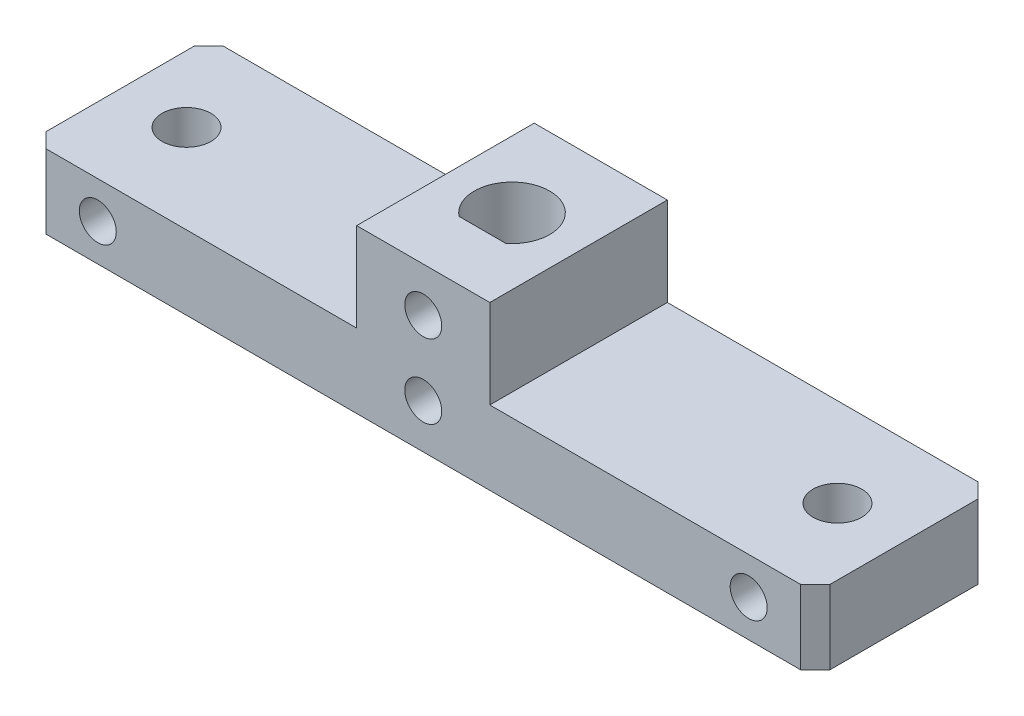
ISO-10303-21;
HEADER;
FILE_DESCRIPTION(('STEP AP214'),'2;1');
FILE_NAME('part.step','',(''),(''),'','','');
FILE_SCHEMA(('AUTOMOTIVE_DESIGN { 1 0 10303 214 1 1 1 1 }'));
ENDSEC;
DATA;
#1=APPLICATION_CONTEXT('core data for automotive mechanical design processes');
#2=APPLICATION_PROTOCOL_DEFINITION('international standard','automotive_design',2000,#1);
#3=PRODUCT_CONTEXT('',#1,'mechanical');
#4=PRODUCT('Part','Part','',(#3));
#5=PRODUCT_RELATED_PRODUCT_CATEGORY('part','',(#4));
#6=PRODUCT_DEFINITION_FORMATION('','',#4);
#7=PRODUCT_DEFINITION_CONTEXT('part definition',#1,'design');
#8=PRODUCT_DEFINITION('design','',#6,#7);
#9=PRODUCT_DEFINITION_SHAPE('','',#8);
#10=(LENGTH_UNIT() NAMED_UNIT(*) SI_UNIT(.MILLI.,.METRE.));
#11=(NAMED_UNIT(*) PLANE_ANGLE_UNIT() SI_UNIT($,.RADIAN.));
#12=(NAMED_UNIT(*) SI_UNIT($,.STERADIAN.) SOLID_ANGLE_UNIT());
#13=UNCERTAINTY_MEASURE_WITH_UNIT(LENGTH_MEASURE(1.E-05),#10,'distance_accuracy_value','');
#14=(GEOMETRIC_REPRESENTATION_CONTEXT(3) GLOBAL_UNCERTAINTY_ASSIGNED_CONTEXT((#13)) GLOBAL_UNIT_ASSIGNED_CONTEXT((#10,
#11,#12)) REPRESENTATION_CONTEXT('',''));
#15=CARTESIAN_POINT('',(0.,0.,0.));
#16=DIRECTION('',(0.,0.,1.));
#17=DIRECTION('',(1.,0.,0.));
#18=AXIS2_PLACEMENT_3D('',#15,#16,#17);
#19=CARTESIAN_POINT('',(4.5,11.,-12.));
#20=DIRECTION('',(0.,1.,0.));
#21=DIRECTION('',(0.,0.,1.));
#22=AXIS2_PLACEMENT_3D('',#19,#20,#21);
#23=PLANE('',#22);
#24=DIRECTION('',(-1.,0.,0.));
#25=VECTOR('',#24,1.);
#26=CARTESIAN_POINT('',(4.5,11.,0.));
#27=LINE('',#26,#25);
#28=CARTESIAN_POINT('',(4.5,11.,0.));
#29=VERTEX_POINT('',#28);
#30=CARTESIAN_POINT('',(-4.5,11.,0.));
#31=VERTEX_POINT('',#30);
#32=EDGE_CURVE('E210',#29,#31,#27,.T.);
#33=ORIENTED_EDGE('',*,*,#32,.F.);
#34=DIRECTION('',(0.,0.,1.));
#35=VECTOR('',#34,1.);
#36=CARTESIAN_POINT('',(4.5,11.,-12.));
#37=LINE('',#36,#35);
#38=CARTESIAN_POINT('',(4.5,11.,-12.));
#39=VERTEX_POINT('',#38);
#40=EDGE_CURVE('E226',#39,#29,#37,.T.);
#41=ORIENTED_EDGE('',*,*,#40,.F.);
#42=DIRECTION('',(-1.,0.,0.));
#43=VECTOR('',#42,1.);
#44=CARTESIAN_POINT('',(4.5,11.,-12.));
#45=LINE('',#44,#43);
#46=CARTESIAN_POINT('',(-4.5,11.,-12.));
#47=VERTEX_POINT('',#46);
#48=EDGE_CURVE('E193',#39,#47,#45,.T.);
#49=ORIENTED_EDGE('',*,*,#48,.T.);
#50=DIRECTION('',(0.,0.,1.));
#51=VECTOR('',#50,1.);
#52=CARTESIAN_POINT('',(-4.5,11.,-12.));
#53=LINE('',#52,#51);
#54=EDGE_CURVE('E224',#47,#31,#53,.T.);
#55=ORIENTED_EDGE('',*,*,#54,.T.);
#56=EDGE_LOOP('',(#33,#41,#49,#55));
#57=FACE_BOUND('',#56,.T.);
#58=DIRECTION('',(1.,0.,0.));
#59=VECTOR('',#58,1.);
#60=CARTESIAN_POINT('',(-1.58192920195564,11.,-4.));
#61=LINE('',#60,#59);
#62=CARTESIAN_POINT('',(-1.58192920195564,11.,-4.));
#63=VERTEX_POINT('',#62);
#64=CARTESIAN_POINT('',(1.58192920195564,11.,-4.));
#65=VERTEX_POINT('',#64);
#66=EDGE_CURVE('E145',#63,#65,#61,.T.);
#67=ORIENTED_EDGE('',*,*,#66,.F.);
#68=CARTESIAN_POINT('',(0.,11.,-6.));
#69=DIRECTION('',(0.,1.,0.));
#70=DIRECTION('',(0.,0.,1.));
#71=AXIS2_PLACEMENT_3D('',#68,#69,#70);
#72=CIRCLE('',#71,2.55);
#73=EDGE_CURVE('E155',#65,#63,#72,.T.);
#74=ORIENTED_EDGE('',*,*,#73,.F.);
#75=EDGE_LOOP('',(#67,#74));
#76=FACE_BOUND('',#75,.T.);
#77=ADVANCED_FACE('F44',(#57,#76),#23,.T.);
#78=CARTESIAN_POINT('',(-26.5,0.,-12.));
#79=DIRECTION('',(0.,-1.,0.));
#80=DIRECTION('',(0.,0.,-1.));
#81=AXIS2_PLACEMENT_3D('',#78,#79,#80);
#82=PLANE('',#81);
#83=CARTESIAN_POINT('',(-22.,0.,-6.));
#84=DIRECTION('',(0.,-1.,0.));
#85=DIRECTION('',(0.,0.,-1.));
#86=AXIS2_PLACEMENT_3D('',#83,#84,#85);
#87=CIRCLE('',#86,1.64999999999999);
#88=CARTESIAN_POINT('',(-22.,0.,-7.64999999999999));
#89=VERTEX_POINT('',#88);
#90=EDGE_CURVE('E171',#89,#89,#87,.T.);
#91=ORIENTED_EDGE('',*,*,#90,.F.);
#92=EDGE_LOOP('',(#91));
#93=FACE_BOUND('',#92,.T.);
#94=CARTESIAN_POINT('',(22.,0.,-6.00000000000001));
#95=DIRECTION('',(0.,-1.,0.));
#96=DIRECTION('',(0.,0.,-1.));
#97=AXIS2_PLACEMENT_3D('',#94,#95,#96);
#98=CIRCLE('',#97,1.64999999999999);
#99=CARTESIAN_POINT('',(22.,0.,-7.65));
#100=VERTEX_POINT('',#99);
#101=EDGE_CURVE('E177',#100,#100,#98,.T.);
#102=ORIENTED_EDGE('',*,*,#101,.F.);
#103=EDGE_LOOP('',(#102));
#104=FACE_BOUND('',#103,.T.);
#105=DIRECTION('',(0.,0.,1.));
#106=VECTOR('',#105,1.);
#107=CARTESIAN_POINT('',(-26.5,0.,-12.));
#108=LINE('',#107,#106);
#109=CARTESIAN_POINT('',(-26.5,0.,-11.));
#110=VERTEX_POINT('',#109);
#111=CARTESIAN_POINT('',(-26.5,0.,-1.));
#112=VERTEX_POINT('',#111);
#113=EDGE_CURVE('E202',#110,#112,#108,.T.);
#114=ORIENTED_EDGE('',*,*,#113,.F.);
#115=DIRECTION('',(0.707106781186549,0.,-0.707106781186546));
#116=VECTOR('',#115,1.);
#117=CARTESIAN_POINT('',(-26.,0.,-11.5));
#118=LINE('',#117,#116);
#119=CARTESIAN_POINT('',(-25.5,0.,-12.));
#120=VERTEX_POINT('',#119);
#121=EDGE_CURVE('E248',#110,#120,#118,.T.);
#122=ORIENTED_EDGE('',*,*,#121,.T.);
#123=DIRECTION('',(1.,0.,0.));
#124=VECTOR('',#123,1.);
#125=CARTESIAN_POINT('',(-26.5,0.,-12.));
#126=LINE('',#125,#124);
#127=CARTESIAN_POINT('',(25.5,0.,-12.));
#128=VERTEX_POINT('',#127);
#129=EDGE_CURVE('E184',#120,#128,#126,.T.);
#130=ORIENTED_EDGE('',*,*,#129,.T.);
#131=DIRECTION('',(0.70710678118655,0.,0.707106781186545));
#132=VECTOR('',#131,1.);
#133=CARTESIAN_POINT('',(-0.500000000000184,0.,-38.));
#134=LINE('',#133,#132);
#135=CARTESIAN_POINT('',(26.5,0.,-11.));
#136=VERTEX_POINT('',#135);
#137=EDGE_CURVE('E244',#128,#136,#134,.T.);
#138=ORIENTED_EDGE('',*,*,#137,.T.);
#139=DIRECTION('',(0.,0.,1.));
#140=VECTOR('',#139,1.);
#141=CARTESIAN_POINT('',(26.5,0.,-12.));
#142=LINE('',#141,#140);
#143=CARTESIAN_POINT('',(26.5,0.,-1.));
#144=VERTEX_POINT('',#143);
#145=EDGE_CURVE('E233',#136,#144,#142,.T.);
#146=ORIENTED_EDGE('',*,*,#145,.T.);
#147=DIRECTION('',(0.707106781186548,0.,-0.707106781186548));
#148=VECTOR('',#147,1.);
#149=CARTESIAN_POINT('',(5.5,0.,20.));
#150=LINE('',#149,#148);
#151=CARTESIAN_POINT('',(25.5,0.,0.));
#152=VERTEX_POINT('',#151);
#153=EDGE_CURVE('E242',#144,#152,#150,.F.);
#154=ORIENTED_EDGE('',*,*,#153,.T.);
#155=DIRECTION('',(1.,0.,0.));
#156=VECTOR('',#155,1.);
#157=CARTESIAN_POINT('',(-26.5,0.,0.));
#158=LINE('',#157,#156);
#159=CARTESIAN_POINT('',(-25.5,0.,0.));
#160=VERTEX_POINT('',#159);
#161=EDGE_CURVE('E183',#160,#152,#158,.T.);
#162=ORIENTED_EDGE('',*,*,#161,.F.);
#163=DIRECTION('',(0.707106781186544,0.,0.707106781186551));
#164=VECTOR('',#163,1.);
#165=CARTESIAN_POINT('',(-32.,0.,-6.50000000000006));
#166=LINE('',#165,#164);
#167=EDGE_CURVE('E246',#160,#112,#166,.F.);
#168=ORIENTED_EDGE('',*,*,#167,.T.);
#169=EDGE_LOOP('',(#114,#122,#130,#138,#146,#154,#162,#168));
#170=FACE_BOUND('',#169,.T.);
#171=DIRECTION('',(1.,0.,0.));
#172=VECTOR('',#171,1.);
#173=CARTESIAN_POINT('',(-1.58192920195564,0.,-4.));
#174=LINE('',#173,#172);
#175=CARTESIAN_POINT('',(-1.58192920195564,0.,-4.));
#176=VERTEX_POINT('',#175);
#177=CARTESIAN_POINT('',(1.58192920195564,0.,-4.));
#178=VERTEX_POINT('',#177);
#179=EDGE_CURVE('E162',#176,#178,#174,.T.);
#180=ORIENTED_EDGE('',*,*,#179,.T.);
#181=CARTESIAN_POINT('',(0.,0.,-6.));
#182=DIRECTION('',(0.,1.,0.));
#183=DIRECTION('',(0.,0.,1.));
#184=AXIS2_PLACEMENT_3D('',#181,#182,#183);
#185=CIRCLE('',#184,2.55);
#186=EDGE_CURVE('E160',#178,#176,#185,.T.);
#187=ORIENTED_EDGE('',*,*,#186,.T.);
#188=EDGE_LOOP('',(#180,#187));
#189=FACE_BOUND('',#188,.T.);
#190=ADVANCED_FACE('F283',(#93,#104,#170,#189),#82,.T.);
#191=CARTESIAN_POINT('',(-26.5,5.,-12.));
#192=DIRECTION('',(-1.,0.,0.));
#193=DIRECTION('',(0.,-1.,0.));
#194=AXIS2_PLACEMENT_3D('',#191,#192,#193);
#195=PLANE('',#194);
#196=DIRECTION('',(0.,0.,1.));
#197=VECTOR('',#196,1.);
#198=CARTESIAN_POINT('',(-26.5,5.,-12.));
#199=LINE('',#198,#197);
#200=CARTESIAN_POINT('',(-26.5,5.,-11.));
#201=VERTEX_POINT('',#200);
#202=CARTESIAN_POINT('',(-26.5,5.,-1.));
#203=VERTEX_POINT('',#202);
#204=EDGE_CURVE('E218',#201,#203,#199,.T.);
#205=ORIENTED_EDGE('',*,*,#204,.F.);
#206=DIRECTION('',(0.,-1.,0.));
#207=VECTOR('',#206,1.);
#208=CARTESIAN_POINT('',(-26.5,0.,-11.));
#209=LINE('',#208,#207);
#210=EDGE_CURVE('E239',#201,#110,#209,.T.);
#211=ORIENTED_EDGE('',*,*,#210,.T.);
#212=ORIENTED_EDGE('',*,*,#113,.T.);
#213=DIRECTION('',(0.,1.,0.));
#214=VECTOR('',#213,1.);
#215=CARTESIAN_POINT('',(-26.5,5.,-1.));
#216=LINE('',#215,#214);
#217=EDGE_CURVE('E221',#112,#203,#216,.T.);
#218=ORIENTED_EDGE('',*,*,#217,.T.);
#219=EDGE_LOOP('',(#205,#211,#212,#218));
#220=FACE_BOUND('',#219,.T.);
#221=ADVANCED_FACE('F297',(#220),#195,.T.);
#222=CARTESIAN_POINT('',(-4.5,5.,-12.));
#223=DIRECTION('',(0.,1.,0.));
#224=DIRECTION('',(-1.,0.,0.));
#225=AXIS2_PLACEMENT_3D('',#222,#223,#224);
#226=PLANE('',#225);
#227=CARTESIAN_POINT('',(-22.,5.,-6.));
#228=DIRECTION('',(0.,1.,0.));
#229=DIRECTION('',(-1.,0.,0.));
#230=AXIS2_PLACEMENT_3D('',#227,#228,#229);
#231=CIRCLE('',#230,1.64999999999999);
#232=CARTESIAN_POINT('',(-23.65,5.,-6.));
#233=VERTEX_POINT('',#232);
#234=EDGE_CURVE('E174',#233,#233,#231,.T.);
#235=ORIENTED_EDGE('',*,*,#234,.F.);
#236=EDGE_LOOP('',(#235));
#237=FACE_BOUND('',#236,.T.);
#238=DIRECTION('',(-1.,0.,0.));
#239=VECTOR('',#238,1.);
#240=CARTESIAN_POINT('',(-4.5,5.,-12.));
#241=LINE('',#240,#239);
#242=CARTESIAN_POINT('',(-4.5,5.,-12.));
#243=VERTEX_POINT('',#242);
#244=CARTESIAN_POINT('',(-25.5,5.,-12.));
#245=VERTEX_POINT('',#244);
#246=EDGE_CURVE('E199',#243,#245,#241,.T.);
#247=ORIENTED_EDGE('',*,*,#246,.T.);
#248=DIRECTION('',(-0.707106781186549,0.,0.707106781186546));
#249=VECTOR('',#248,1.);
#250=CARTESIAN_POINT('',(-15.,5.,-22.5));
#251=LINE('',#250,#249);
#252=EDGE_CURVE('E256',#245,#201,#251,.T.);
#253=ORIENTED_EDGE('',*,*,#252,.T.);
#254=ORIENTED_EDGE('',*,*,#204,.T.);
#255=DIRECTION('',(-0.707106781186544,0.,-0.707106781186551));
#256=VECTOR('',#255,1.);
#257=CARTESIAN_POINT('',(-21.0000000000001,5.,4.49999999999994));
#258=LINE('',#257,#256);
#259=CARTESIAN_POINT('',(-25.5,5.,0.));
#260=VERTEX_POINT('',#259);
#261=EDGE_CURVE('E254',#203,#260,#258,.F.);
#262=ORIENTED_EDGE('',*,*,#261,.T.);
#263=DIRECTION('',(-1.,0.,0.));
#264=VECTOR('',#263,1.);
#265=CARTESIAN_POINT('',(-4.5,5.,0.));
#266=LINE('',#265,#264);
#267=CARTESIAN_POINT('',(-4.5,5.,0.));
#268=VERTEX_POINT('',#267);
#269=EDGE_CURVE('E188',#268,#260,#266,.T.);
#270=ORIENTED_EDGE('',*,*,#269,.F.);
#271=DIRECTION('',(0.,0.,1.));
#272=VECTOR('',#271,1.);
#273=CARTESIAN_POINT('',(-4.5,5.,-12.));
#274=LINE('',#273,#272);
#275=EDGE_CURVE('E222',#243,#268,#274,.T.);
#276=ORIENTED_EDGE('',*,*,#275,.F.);
#277=EDGE_LOOP('',(#247,#253,#254,#262,#270,#276));
#278=FACE_BOUND('',#277,.T.);
#279=ADVANCED_FACE('F294',(#237,#278),#226,.T.);
#280=CARTESIAN_POINT('',(-4.5,11.,-12.));
#281=DIRECTION('',(-1.,0.,0.));
#282=DIRECTION('',(0.,-1.,0.));
#283=AXIS2_PLACEMENT_3D('',#280,#281,#282);
#284=PLANE('',#283);
#285=DIRECTION('',(0.,-1.,0.));
#286=VECTOR('',#285,1.);
#287=CARTESIAN_POINT('',(-4.5,11.,0.));
#288=LINE('',#287,#286);
#289=EDGE_CURVE('E213',#31,#268,#288,.T.);
#290=ORIENTED_EDGE('',*,*,#289,.F.);
#291=ORIENTED_EDGE('',*,*,#54,.F.);
#292=DIRECTION('',(0.,-1.,0.));
#293=VECTOR('',#292,1.);
#294=CARTESIAN_POINT('',(-4.5,11.,-12.));
#295=LINE('',#294,#293);
#296=EDGE_CURVE('E196',#47,#243,#295,.T.);
#297=ORIENTED_EDGE('',*,*,#296,.T.);
#298=ORIENTED_EDGE('',*,*,#275,.T.);
#299=EDGE_LOOP('',(#290,#291,#297,#298));
#300=FACE_BOUND('',#299,.T.);
#301=ADVANCED_FACE('F309',(#300),#284,.T.);
#302=CARTESIAN_POINT('',(4.50000000000001,5.00000000000001,-12.));
#303=DIRECTION('',(1.,0.,0.));
#304=DIRECTION('',(0.,1.,0.));
#305=AXIS2_PLACEMENT_3D('',#302,#303,#304);
#306=PLANE('',#305);
#307=DIRECTION('',(0.,1.,0.));
#308=VECTOR('',#307,1.);
#309=CARTESIAN_POINT('',(4.50000000000001,5.00000000000001,0.));
#310=LINE('',#309,#308);
#311=CARTESIAN_POINT('',(4.50000000000001,5.00000000000001,0.));
#312=VERTEX_POINT('',#311);
#313=EDGE_CURVE('E207',#312,#29,#310,.T.);
#314=ORIENTED_EDGE('',*,*,#313,.F.);
#315=DIRECTION('',(0.,0.,1.));
#316=VECTOR('',#315,1.);
#317=CARTESIAN_POINT('',(4.50000000000001,5.00000000000001,-12.));
#318=LINE('',#317,#316);
#319=CARTESIAN_POINT('',(4.50000000000001,5.00000000000001,-12.));
#320=VERTEX_POINT('',#319);
#321=EDGE_CURVE('E228',#320,#312,#318,.T.);
#322=ORIENTED_EDGE('',*,*,#321,.F.);
#323=DIRECTION('',(0.,1.,0.));
#324=VECTOR('',#323,1.);
#325=CARTESIAN_POINT('',(4.50000000000001,5.00000000000001,-12.));
#326=LINE('',#325,#324);
#327=EDGE_CURVE('E190',#320,#39,#326,.T.);
#328=ORIENTED_EDGE('',*,*,#327,.T.);
#329=ORIENTED_EDGE('',*,*,#40,.T.);
#330=EDGE_LOOP('',(#314,#322,#328,#329));
#331=FACE_BOUND('',#330,.T.);
#332=ADVANCED_FACE('F314',(#331),#306,.T.);
#333=CARTESIAN_POINT('',(26.5,5.00000000000003,-12.));
#334=DIRECTION('',(0.,1.,0.));
#335=DIRECTION('',(-1.,0.,0.));
#336=AXIS2_PLACEMENT_3D('',#333,#334,#335);
#337=PLANE('',#336);
#338=CARTESIAN_POINT('',(22.,5.00000000000003,-6.00000000000001));
#339=DIRECTION('',(0.,1.,0.));
#340=DIRECTION('',(-1.,0.,0.));
#341=AXIS2_PLACEMENT_3D('',#338,#339,#340);
#342=CIRCLE('',#341,1.64999999999999);
#343=CARTESIAN_POINT('',(20.35,5.00000000000003,-6.00000000000001));
#344=VERTEX_POINT('',#343);
#345=EDGE_CURVE('E180',#344,#344,#342,.T.);
#346=ORIENTED_EDGE('',*,*,#345,.F.);
#347=EDGE_LOOP('',(#346));
#348=FACE_BOUND('',#347,.T.);
#349=DIRECTION('',(0.,0.,1.));
#350=VECTOR('',#349,1.);
#351=CARTESIAN_POINT('',(26.5,5.00000000000003,-12.));
#352=LINE('',#351,#350);
#353=CARTESIAN_POINT('',(26.5,5.00000000000003,-11.));
#354=VERTEX_POINT('',#353);
#355=CARTESIAN_POINT('',(26.5,5.00000000000003,-1.));
#356=VERTEX_POINT('',#355);
#357=EDGE_CURVE('E231',#354,#356,#352,.T.);
#358=ORIENTED_EDGE('',*,*,#357,.F.);
#359=DIRECTION('',(-0.70710678118655,0.,-0.707106781186545));
#360=VECTOR('',#359,1.);
#361=CARTESIAN_POINT('',(26.,5.00000000000003,-11.5));
#362=LINE('',#361,#360);
#363=CARTESIAN_POINT('',(25.5,5.00000000000003,-12.));
#364=VERTEX_POINT('',#363);
#365=EDGE_CURVE('E11',#354,#364,#362,.T.);
#366=ORIENTED_EDGE('',*,*,#365,.T.);
#367=DIRECTION('',(-1.,0.,0.));
#368=VECTOR('',#367,1.);
#369=CARTESIAN_POINT('',(26.5,5.00000000000003,-12.));
#370=LINE('',#369,#368);
#371=EDGE_CURVE('E187',#364,#320,#370,.T.);
#372=ORIENTED_EDGE('',*,*,#371,.T.);
#373=ORIENTED_EDGE('',*,*,#321,.T.);
#374=DIRECTION('',(-1.,0.,0.));
#375=VECTOR('',#374,1.);
#376=CARTESIAN_POINT('',(26.5,5.00000000000003,0.));
#377=LINE('',#376,#375);
#378=CARTESIAN_POINT('',(25.5,5.00000000000003,0.));
#379=VERTEX_POINT('',#378);
#380=EDGE_CURVE('E205',#379,#312,#377,.T.);
#381=ORIENTED_EDGE('',*,*,#380,.F.);
#382=DIRECTION('',(-0.707106781186548,0.,0.707106781186548));
#383=VECTOR('',#382,1.);
#384=CARTESIAN_POINT('',(32.,5.00000000000004,-6.5));
#385=LINE('',#384,#383);
#386=EDGE_CURVE('E53',#379,#356,#385,.F.);
#387=ORIENTED_EDGE('',*,*,#386,.T.);
#388=EDGE_LOOP('',(#358,#366,#372,#373,#381,#387));
#389=FACE_BOUND('',#388,.T.);
#390=ADVANCED_FACE('F272',(#348,#389),#337,.T.);
#391=CARTESIAN_POINT('',(26.5,0.,-12.));
#392=DIRECTION('',(1.,0.,0.));
#393=DIRECTION('',(0.,1.,0.));
#394=AXIS2_PLACEMENT_3D('',#391,#392,#393);
#395=PLANE('',#394);
#396=ORIENTED_EDGE('',*,*,#145,.F.);
#397=DIRECTION('',(0.,1.,0.));
#398=VECTOR('',#397,1.);
#399=CARTESIAN_POINT('',(26.5,5.00000000000004,-11.));
#400=LINE('',#399,#398);
#401=EDGE_CURVE('E266',#136,#354,#400,.T.);
#402=ORIENTED_EDGE('',*,*,#401,.T.);
#403=ORIENTED_EDGE('',*,*,#357,.T.);
#404=DIRECTION('',(0.,-1.,0.));
#405=VECTOR('',#404,1.);
#406=CARTESIAN_POINT('',(26.5,0.,-1.));
#407=LINE('',#406,#405);
#408=EDGE_CURVE('E264',#356,#144,#407,.T.);
#409=ORIENTED_EDGE('',*,*,#408,.T.);
#410=EDGE_LOOP('',(#396,#402,#403,#409));
#411=FACE_BOUND('',#410,.T.);
#412=ADVANCED_FACE('F269',(#411),#395,.T.);
#413=CARTESIAN_POINT('',(0.,0.,-12.));
#414=DIRECTION('',(0.,0.,1.));
#415=DIRECTION('',(1.,0.,0.));
#416=AXIS2_PLACEMENT_3D('',#413,#414,#415);
#417=PLANE('',#416);
#418=ORIENTED_EDGE('',*,*,#129,.F.);
#419=DIRECTION('',(0.,1.,0.));
#420=VECTOR('',#419,1.);
#421=CARTESIAN_POINT('',(-25.5,5.,-12.));
#422=LINE('',#421,#420);
#423=EDGE_CURVE('E252',#120,#245,#422,.T.);
#424=ORIENTED_EDGE('',*,*,#423,.T.);
#425=ORIENTED_EDGE('',*,*,#246,.F.);
#426=ORIENTED_EDGE('',*,*,#296,.F.);
#427=ORIENTED_EDGE('',*,*,#48,.F.);
#428=ORIENTED_EDGE('',*,*,#327,.F.);
#429=ORIENTED_EDGE('',*,*,#371,.F.);
#430=DIRECTION('',(0.,-1.,0.));
#431=VECTOR('',#430,1.);
#432=CARTESIAN_POINT('',(25.5,0.,-12.));
#433=LINE('',#432,#431);
#434=EDGE_CURVE('E250',#364,#128,#433,.T.);
#435=ORIENTED_EDGE('',*,*,#434,.T.);
#436=EDGE_LOOP('',(#418,#424,#425,#426,#427,#428,#429,#435));
#437=FACE_BOUND('',#436,.T.);
#438=ADVANCED_FACE('F278',(#437),#417,.F.);
#439=CARTESIAN_POINT('',(0.,0.,0.));
#440=DIRECTION('',(0.,0.,1.));
#441=DIRECTION('',(1.,0.,0.));
#442=AXIS2_PLACEMENT_3D('',#439,#440,#441);
#443=PLANE('',#442);
#444=CARTESIAN_POINT('',(-22.,2.50000000000002,0.));
#445=DIRECTION('',(0.,0.,1.));
#446=DIRECTION('',(1.,0.,0.));
#447=AXIS2_PLACEMENT_3D('',#444,#445,#446);
#448=CIRCLE('',#447,1.24999999999999);
#449=CARTESIAN_POINT('',(-20.75,2.50000000000002,0.));
#450=VERTEX_POINT('',#449);
#451=EDGE_CURVE('E620',#450,#450,#448,.T.);
#452=ORIENTED_EDGE('',*,*,#451,.F.);
#453=EDGE_LOOP('',(#452));
#454=FACE_BOUND('',#453,.T.);
#455=CARTESIAN_POINT('',(22.,2.50000000000002,0.));
#456=DIRECTION('',(0.,0.,1.));
#457=DIRECTION('',(1.,0.,0.));
#458=AXIS2_PLACEMENT_3D('',#455,#456,#457);
#459=CIRCLE('',#458,1.24999999999999);
#460=CARTESIAN_POINT('',(23.25,2.50000000000002,0.));
#461=VERTEX_POINT('',#460);
#462=EDGE_CURVE('E595',#461,#461,#459,.T.);
#463=ORIENTED_EDGE('',*,*,#462,.F.);
#464=EDGE_LOOP('',(#463));
#465=FACE_BOUND('',#464,.T.);
#466=CARTESIAN_POINT('',(0.,8.,0.));
#467=DIRECTION('',(0.,0.,1.));
#468=DIRECTION('',(1.,0.,0.));
#469=AXIS2_PLACEMENT_3D('',#466,#467,#468);
#470=CIRCLE('',#469,1.24999999999999);
#471=CARTESIAN_POINT('',(1.24999999999999,8.,0.));
#472=VERTEX_POINT('',#471);
#473=EDGE_CURVE('E594',#472,#472,#470,.T.);
#474=ORIENTED_EDGE('',*,*,#473,.F.);
#475=EDGE_LOOP('',(#474));
#476=FACE_BOUND('',#475,.T.);
#477=CARTESIAN_POINT('',(0.,3.,0.));
#478=DIRECTION('',(0.,0.,1.));
#479=DIRECTION('',(1.,0.,0.));
#480=AXIS2_PLACEMENT_3D('',#477,#478,#479);
#481=CIRCLE('',#480,1.24999999999999);
#482=CARTESIAN_POINT('',(1.24999999999999,3.,0.));
#483=VERTEX_POINT('',#482);
#484=EDGE_CURVE('E601',#483,#483,#481,.T.);
#485=ORIENTED_EDGE('',*,*,#484,.F.);
#486=EDGE_LOOP('',(#485));
#487=FACE_BOUND('',#486,.T.);
#488=ORIENTED_EDGE('',*,*,#269,.T.);
#489=DIRECTION('',(0.,-1.,0.));
#490=VECTOR('',#489,1.);
#491=CARTESIAN_POINT('',(-25.5,0.,0.));
#492=LINE('',#491,#490);
#493=EDGE_CURVE('E261',#260,#160,#492,.T.);
#494=ORIENTED_EDGE('',*,*,#493,.T.);
#495=ORIENTED_EDGE('',*,*,#161,.T.);
#496=DIRECTION('',(0.,1.,0.));
#497=VECTOR('',#496,1.);
#498=CARTESIAN_POINT('',(25.5,0.,0.));
#499=LINE('',#498,#497);
#500=EDGE_CURVE('E258',#152,#379,#499,.T.);
#501=ORIENTED_EDGE('',*,*,#500,.T.);
#502=ORIENTED_EDGE('',*,*,#380,.T.);
#503=ORIENTED_EDGE('',*,*,#313,.T.);
#504=ORIENTED_EDGE('',*,*,#32,.T.);
#505=ORIENTED_EDGE('',*,*,#289,.T.);
#506=EDGE_LOOP('',(#488,#494,#495,#501,#502,#503,#504,#505));
#507=FACE_BOUND('',#506,.T.);
#508=ADVANCED_FACE('F304',(#454,#465,#476,#487,#507),#443,.T.);
#509=CARTESIAN_POINT('',(22.,0.,-6.00000000000001));
#510=DIRECTION('',(0.,-1.,0.));
#511=DIRECTION('',(0.,0.,-1.));
#512=AXIS2_PLACEMENT_3D('',#509,#510,#511);
#513=CYLINDRICAL_SURFACE('',#512,1.64999999999999);
#514=CARTESIAN_POINT('',(23.25,2.50000000000002,-4.92296703857311));
#515=CARTESIAN_POINT('',(23.2499921483348,2.55804444947864,-4.9229506207044));
#516=CARTESIAN_POINT('',(23.2459045043683,2.61615010984883,-4.91815796381315));
#517=CARTESIAN_POINT('',(23.2300143019573,2.73000921003107,-4.90013950186176));
#518=CARTESIAN_POINT('',(23.21818411429,2.78575346177427,-4.88688349956446));
#519=CARTESIAN_POINT('',(23.18465710464,2.9045275214471,-4.85117667918064));
#520=CARTESIAN_POINT('',(23.1614345663849,2.96670753358605,-4.827397842559));
#521=CARTESIAN_POINT('',(23.1065157798252,3.08514856837618,-4.77543690815316));
#522=CARTESIAN_POINT('',(23.0748083158257,3.1414016183728,-4.74724900293593));
#523=CARTESIAN_POINT('',(23.0027639216693,3.24917223550719,-4.68882921463891));
#524=CARTESIAN_POINT('',(22.9622428748645,3.30054865524436,-4.65856498290384));
#525=CARTESIAN_POINT('',(22.8733781324916,3.39665360876357,-4.59908283015535));
#526=CARTESIAN_POINT('',(22.82504118386,3.44138781299345,-4.56986403302234));
#527=CARTESIAN_POINT('',(22.7229582143096,3.52169800074396,-4.51573998036955));
#528=CARTESIAN_POINT('',(22.6695231151998,3.55757884643992,-4.49070539859495));
#529=CARTESIAN_POINT('',(22.5561837071499,3.62132977676978,-4.44536855952225));
#530=CARTESIAN_POINT('',(22.4962807463545,3.6492015263818,-4.42506531881123));
#531=CARTESIAN_POINT('',(22.3705523445062,3.69570798998145,-4.39081775286639));
#532=CARTESIAN_POINT('',(22.3046782771455,3.71425695876181,-4.37693254705469));
#533=CARTESIAN_POINT('',(22.1696270530949,3.74033761016004,-4.35733101137911));
#534=CARTESIAN_POINT('',(22.1004542420776,3.74788339544632,-4.35160422516909));
#535=CARTESIAN_POINT('',(21.9723010114039,3.75107947180414,-4.34918155835974));
#536=CARTESIAN_POINT('',(21.9133772633778,3.74837036924068,-4.3512401068293));
#537=CARTESIAN_POINT('',(21.7970295910036,3.73480014646174,-4.36149114691153));
#538=CARTESIAN_POINT('',(21.7396056973932,3.72393885931193,-4.36968376413306));
#539=CARTESIAN_POINT('',(21.6295466032159,3.69515890437941,-4.3911753234263));
#540=CARTESIAN_POINT('',(21.5768185270377,3.67746703813315,-4.40430985009125));
#541=CARTESIAN_POINT('',(21.4752154394935,3.63583372063105,-4.43477882554457));
#542=CARTESIAN_POINT('',(21.4263410999158,3.61189118287246,-4.45211400446008));
#543=CARTESIAN_POINT('',(21.3268673347571,3.55503325993281,-4.49247196828302));
#544=CARTESIAN_POINT('',(21.2768912202744,3.52135076758441,-4.51594341289906));
#545=CARTESIAN_POINT('',(21.1830053100023,3.44793370033147,-4.56548136707529));
#546=CARTESIAN_POINT('',(21.1391027922312,3.4081919824164,-4.59155092673296));
#547=CARTESIAN_POINT('',(21.0493096071294,3.31468226190858,-4.65014409939101));
#548=CARTESIAN_POINT('',(21.0048287718293,3.25970520804199,-4.6829024759048));
#549=CARTESIAN_POINT('',(20.9253747416773,3.14241550872608,-4.74689470938857));
#550=CARTESIAN_POINT('',(20.890399407328,3.08010451853081,-4.77812890811966));
#551=CARTESIAN_POINT('',(20.8392287078819,2.96671138095955,-4.82697254482192));
#552=CARTESIAN_POINT('',(20.820516699323,2.91736084078878,-4.84594970306177));
#553=CARTESIAN_POINT('',(20.7892141947835,2.81517834637323,-4.8788330340223));
#554=CARTESIAN_POINT('',(20.7766091127434,2.76235503314396,-4.89275126962476));
#555=CARTESIAN_POINT('',(20.7597432392205,2.66251402167053,-4.91169787402625));
#556=CARTESIAN_POINT('',(20.7544904872187,2.61586895469849,-4.91777126377214));
#557=CARTESIAN_POINT('',(20.7493084769088,2.52190040120287,-4.92376159857672));
#558=CARTESIAN_POINT('',(20.7493751017824,2.47457746766079,-4.92368330460056));
#559=CARTESIAN_POINT('',(20.754813533365,2.38076559951331,-4.91739899374116));
#560=CARTESIAN_POINT('',(20.7601751416252,2.33427523657489,-4.91120475652845));
#561=CARTESIAN_POINT('',(20.7758045634883,2.24310908867573,-4.89366336202432));
#562=CARTESIAN_POINT('',(20.7860804052011,2.19843640319619,-4.88230777443228));
#563=CARTESIAN_POINT('',(20.8169393044194,2.09096844397071,-4.84953116694612));
#564=CARTESIAN_POINT('',(20.8400987884373,2.02960060674872,-4.825889908131));
#565=CARTESIAN_POINT('',(20.8947096365856,1.91261529429816,-4.77433778131765));
#566=CARTESIAN_POINT('',(20.9261794906778,1.85701103160993,-4.74641745156454));
#567=CARTESIAN_POINT('',(20.9980890223282,1.74966770667784,-4.68816992406905));
#568=CARTESIAN_POINT('',(21.0388220683879,1.69815331160214,-4.65779167331221));
#569=CARTESIAN_POINT('',(21.1281616306927,1.60183161513779,-4.5981144413706));
#570=CARTESIAN_POINT('',(21.1767607141792,1.55701805817057,-4.56881447306689));
#571=CARTESIAN_POINT('',(21.2791567000529,1.47681333506509,-4.51471221043868));
#572=CARTESIAN_POINT('',(21.332606128983,1.44108055229444,-4.48976400217105));
#573=CARTESIAN_POINT('',(21.445945368773,1.37762085297278,-4.44460986928411));
#574=CARTESIAN_POINT('',(21.5058337068485,1.34989211096582,-4.42440286355098));
#575=CARTESIAN_POINT('',(21.6314977532872,1.30366308150326,-4.39034938963644));
#576=CARTESIAN_POINT('',(21.6973216091278,1.28524812064194,-4.37656181997916));
#577=CARTESIAN_POINT('',(21.8322392280232,1.25941340229609,-4.35714256503413));
#578=CARTESIAN_POINT('',(21.9013287615145,1.25197980422692,-4.3515006134543));
#579=CARTESIAN_POINT('',(22.029350886145,1.24895994068979,-4.34921140182062));
#580=CARTESIAN_POINT('',(22.0882306720728,1.25174425901287,-4.35132702126895));
#581=CARTESIAN_POINT('',(22.2044769091747,1.26545041798846,-4.36168008674012));
#582=CARTESIAN_POINT('',(22.261843324758,1.27637244984458,-4.36991767660467));
#583=CARTESIAN_POINT('',(22.3718322990899,1.30526904869321,-4.39149347811575));
#584=CARTESIAN_POINT('',(22.4245452767978,1.32302377595236,-4.40467239408094));
#585=CARTESIAN_POINT('',(22.5261087166898,1.36477878746095,-4.43522365419493));
#586=CARTESIAN_POINT('',(22.5749585389146,1.38878010368837,-4.45259669120604));
#587=CARTESIAN_POINT('',(22.6743975235441,1.4457729250541,-4.49303695343917));
#588=CARTESIAN_POINT('',(22.7243599214621,1.47953416492723,-4.51655361498786));
#589=CARTESIAN_POINT('',(22.8182090672306,1.55311204664981,-4.56617352697844));
#590=CARTESIAN_POINT('',(22.8620882825053,1.59293607009004,-4.59227991679348));
#591=CARTESIAN_POINT('',(22.9518198676369,1.68663290778314,-4.65094058480454));
#592=CARTESIAN_POINT('',(22.9962594725216,1.74171583289152,-4.68372662901874));
#593=CARTESIAN_POINT('',(23.0756087810992,1.859226648595,-4.74774033723831));
#594=CARTESIAN_POINT('',(23.110521350171,1.92165232266237,-4.77896846749218));
#595=CARTESIAN_POINT('',(23.1611885891877,2.03442079413891,-4.8273998448553));
#596=CARTESIAN_POINT('',(23.1795605493218,2.08296851416475,-4.84603561629843));
#597=CARTESIAN_POINT('',(23.2103798523986,2.18342058250486,-4.8784018470485));
#598=CARTESIAN_POINT('',(23.2228438629348,2.23531501275547,-4.89214607877288));
#599=CARTESIAN_POINT('',(23.2378976983118,2.32297633950968,-4.90904207401908));
#600=CARTESIAN_POINT('',(23.2424169345119,2.35802573293143,-4.91421777596367));
#601=CARTESIAN_POINT('',(23.2484700554354,2.42870916858681,-4.92118480042881));
#602=CARTESIAN_POINT('',(23.2500048233131,2.46434303471656,-4.92297712414339));
#603=CARTESIAN_POINT('',(23.25,2.50000000000002,-4.92296703857311));
#604=B_SPLINE_CURVE_WITH_KNOTS('',3,(#514,#515,#516,#517,#518,#519,#520,#521,#522,#523,#524,
#525,#526,#527,#528,#529,#530,#531,#532,#533,#534,#535,#536,#537,#538,#539,#540,#541,#542,#543,
#544,#545,#546,#547,#548,#549,#550,#551,#552,#553,#554,#555,#556,#557,#558,#559,#560,#561,#562,
#563,#564,#565,#566,#567,#568,#569,#570,#571,#572,#573,#574,#575,#576,#577,#578,#579,#580,#581,
#582,#583,#584,#585,#586,#587,#588,#589,#590,#591,#592,#593,#594,#595,#596,#597,#598,#599,#600,
#601,#602,#603),.UNSPECIFIED.,.T.,.F.,(4,2,2,2,2,2,2,2,2,2,2,2,2,2,2,2,2,2,2,2,2,2,2,2,2,2,2,2,
2,2,2,2,2,2,2,2,2,2,2,2,2,2,2,2,4),(0.,0.173943729769861,0.348511586230448,0.558873505777471,
0.76951487504942,0.985071957641455,1.20044394822192,1.40680504221086,1.61312320555188,
1.8213057370137,2.02922120779733,2.20538556553906,2.38155353074104,2.55231534497562,
2.72310686111549,2.91643423713942,3.10999130790664,3.34289234053263,3.57574090832051,
3.74348543345526,3.91082731025696,4.052177113185,4.19341752250921,4.33438642402423,
4.4755864093924,4.68360232243289,4.89208501310436,5.10842541382385,5.32456257144978,
5.530633976167,5.73665834563817,5.94453745280215,6.15215433108921,6.32820548538654,
6.50426077630956,6.67507019125499,6.84590784298309,7.03937549684392,7.2330806145899,
7.4661701363742,7.6991894760173,7.8641612922245,8.02866487584164,8.1355509222945,
8.24240533454907),.UNSPECIFIED.);
#605=CARTESIAN_POINT('',(23.25,2.50000000000002,-4.92296703857311));
#606=VERTEX_POINT('',#605);
#607=EDGE_CURVE('E587',#606,#606,#604,.T.);
#608=ORIENTED_EDGE('',*,*,#607,.T.);
#609=EDGE_LOOP('',(#608));
#610=FACE_BOUND('',#609,.T.);
#611=ORIENTED_EDGE('',*,*,#101,.T.);
#612=EDGE_LOOP('',(#611));
#613=FACE_BOUND('',#612,.T.);
#614=ORIENTED_EDGE('',*,*,#345,.T.);
#615=EDGE_LOOP('',(#614));
#616=FACE_BOUND('',#615,.T.);
#617=ADVANCED_FACE('F457',(#610,#613,#616),#513,.F.);
#618=CARTESIAN_POINT('',(-22.,0.,-6.));
#619=DIRECTION('',(0.,-1.,0.));
#620=DIRECTION('',(0.,0.,-1.));
#621=AXIS2_PLACEMENT_3D('',#618,#619,#620);
#622=CYLINDRICAL_SURFACE('',#621,1.64999999999999);
#623=CARTESIAN_POINT('',(-20.75,2.50000000000002,-4.9229670385731));
#624=CARTESIAN_POINT('',(-20.7500078516652,2.55804444947864,-4.92295062070439));
#625=CARTESIAN_POINT('',(-20.7540954956317,2.61615010984883,-4.91815796381315));
#626=CARTESIAN_POINT('',(-20.7699856980427,2.73000921003107,-4.90013950186175));
#627=CARTESIAN_POINT('',(-20.78181588571,2.78575346177427,-4.88688349956445));
#628=CARTESIAN_POINT('',(-20.81534289536,2.9045275214471,-4.85117667918063));
#629=CARTESIAN_POINT('',(-20.8385654336151,2.96670753358605,-4.82739784255899));
#630=CARTESIAN_POINT('',(-20.8934842201748,3.08514856837618,-4.77543690815316));
#631=CARTESIAN_POINT('',(-20.9251916841743,3.1414016183728,-4.74724900293593));
#632=CARTESIAN_POINT('',(-20.9972360783307,3.24917223550719,-4.6888292146389));
#633=CARTESIAN_POINT('',(-21.0377571251355,3.30054865524436,-4.65856498290384));
#634=CARTESIAN_POINT('',(-21.1266218675084,3.39665360876357,-4.59908283015534));
#635=CARTESIAN_POINT('',(-21.17495881614,3.44138781299345,-4.56986403302233));
#636=CARTESIAN_POINT('',(-21.2770417856904,3.52169800074396,-4.51573998036954));
#637=CARTESIAN_POINT('',(-21.3304768848002,3.55757884643992,-4.49070539859494));
#638=CARTESIAN_POINT('',(-21.4438162928501,3.62132977676978,-4.44536855952225));
#639=CARTESIAN_POINT('',(-21.5037192536455,3.6492015263818,-4.42506531881123));
#640=CARTESIAN_POINT('',(-21.6294476554938,3.69570798998145,-4.39081775286638));
#641=CARTESIAN_POINT('',(-21.6953217228545,3.71425695876181,-4.37693254705469));
#642=CARTESIAN_POINT('',(-21.8303729469051,3.74033761016004,-4.3573310113791));
#643=CARTESIAN_POINT('',(-21.8995457579224,3.74788339544632,-4.35160422516908));
#644=CARTESIAN_POINT('',(-22.0276989885961,3.75107947180414,-4.34918155835973));
#645=CARTESIAN_POINT('',(-22.0866227366222,3.74837036924068,-4.35124010682929));
#646=CARTESIAN_POINT('',(-22.2029704089964,3.73480014646174,-4.36149114691152));
#647=CARTESIAN_POINT('',(-22.2603943026068,3.72393885931193,-4.36968376413305));
#648=CARTESIAN_POINT('',(-22.3704533967841,3.69515890437941,-4.3911753234263));
#649=CARTESIAN_POINT('',(-22.4231814729623,3.67746703813315,-4.40430985009124));
#650=CARTESIAN_POINT('',(-22.5247845605065,3.63583372063105,-4.43477882554457));
#651=CARTESIAN_POINT('',(-22.5736589000842,3.61189118287246,-4.45211400446007));
#652=CARTESIAN_POINT('',(-22.6731326652429,3.55503325993281,-4.49247196828302));
#653=CARTESIAN_POINT('',(-22.7231087797256,3.52135076758441,-4.51594341289905));
#654=CARTESIAN_POINT('',(-22.8169946899977,3.44793370033147,-4.56548136707528));
#655=CARTESIAN_POINT('',(-22.8608972077688,3.4081919824164,-4.59155092673295));
#656=CARTESIAN_POINT('',(-22.9506903928706,3.31468226190858,-4.65014409939101));
#657=CARTESIAN_POINT('',(-22.9951712281707,3.25970520804199,-4.68290247590479));
#658=CARTESIAN_POINT('',(-23.0746252583227,3.14241550872608,-4.74689470938856));
#659=CARTESIAN_POINT('',(-23.109600592672,3.08010451853081,-4.77812890811965));
#660=CARTESIAN_POINT('',(-23.1607712921181,2.96671138095955,-4.82697254482191));
#661=CARTESIAN_POINT('',(-23.179483300677,2.91736084078878,-4.84594970306176));
#662=CARTESIAN_POINT('',(-23.2107858052165,2.81517834637323,-4.87883303402229));
#663=CARTESIAN_POINT('',(-23.2233908872566,2.76235503314396,-4.89275126962475));
#664=CARTESIAN_POINT('',(-23.2402567607795,2.66251402167053,-4.91169787402624));
#665=CARTESIAN_POINT('',(-23.2455095127813,2.61586895469849,-4.91777126377213));
#666=CARTESIAN_POINT('',(-23.2506915230912,2.52190040120287,-4.92376159857671));
#667=CARTESIAN_POINT('',(-23.2506248982175,2.47457746766079,-4.92368330460055));
#668=CARTESIAN_POINT('',(-23.245186466635,2.38076559951331,-4.91739899374116));
#669=CARTESIAN_POINT('',(-23.2398248583748,2.33427523657489,-4.91120475652844));
#670=CARTESIAN_POINT('',(-23.2241954365117,2.24310908867573,-4.89366336202431));
#671=CARTESIAN_POINT('',(-23.2139195947989,2.19843640319619,-4.88230777443227));
#672=CARTESIAN_POINT('',(-23.1830606955806,2.09096844397071,-4.84953116694611));
#673=CARTESIAN_POINT('',(-23.1599012115627,2.02960060674872,-4.82588990813099));
#674=CARTESIAN_POINT('',(-23.1052903634144,1.91261529429816,-4.77433778131764));
#675=CARTESIAN_POINT('',(-23.0738205093222,1.85701103160993,-4.74641745156453));
#676=CARTESIAN_POINT('',(-23.0019109776718,1.74966770667784,-4.68816992406904));
#677=CARTESIAN_POINT('',(-22.9611779316121,1.69815331160214,-4.65779167331221));
#678=CARTESIAN_POINT('',(-22.8718383693073,1.60183161513779,-4.59811444137059));
#679=CARTESIAN_POINT('',(-22.8232392858208,1.55701805817057,-4.56881447306689));
#680=CARTESIAN_POINT('',(-22.7208432999471,1.47681333506509,-4.51471221043867));
#681=CARTESIAN_POINT('',(-22.667393871017,1.44108055229444,-4.48976400217105));
#682=CARTESIAN_POINT('',(-22.554054631227,1.37762085297278,-4.4446098692841));
#683=CARTESIAN_POINT('',(-22.4941662931515,1.34989211096582,-4.42440286355097));
#684=CARTESIAN_POINT('',(-22.3685022467128,1.30366308150326,-4.39034938963643));
#685=CARTESIAN_POINT('',(-22.3026783908722,1.28524812064194,-4.37656181997916));
#686=CARTESIAN_POINT('',(-22.1677607719768,1.25941340229609,-4.35714256503413));
#687=CARTESIAN_POINT('',(-22.0986712384855,1.25197980422692,-4.35150061345429));
#688=CARTESIAN_POINT('',(-21.970649113855,1.24895994068979,-4.34921140182061));
#689=CARTESIAN_POINT('',(-21.9117693279272,1.25174425901287,-4.35132702126894));
#690=CARTESIAN_POINT('',(-21.7955230908253,1.26545041798847,-4.36168008674011));
#691=CARTESIAN_POINT('',(-21.738156675242,1.27637244984458,-4.36991767660466));
#692=CARTESIAN_POINT('',(-21.6281677009101,1.30526904869321,-4.39149347811574));
#693=CARTESIAN_POINT('',(-21.5754547232022,1.32302377595236,-4.40467239408093));
#694=CARTESIAN_POINT('',(-21.4738912833102,1.36477878746095,-4.43522365419492));
#695=CARTESIAN_POINT('',(-21.4250414610854,1.38878010368837,-4.45259669120603));
#696=CARTESIAN_POINT('',(-21.3256024764559,1.4457729250541,-4.49303695343916));
#697=CARTESIAN_POINT('',(-21.2756400785379,1.47953416492723,-4.51655361498786));
#698=CARTESIAN_POINT('',(-21.1817909327694,1.55311204664981,-4.56617352697843));
#699=CARTESIAN_POINT('',(-21.1379117174947,1.59293607009004,-4.59227991679347));
#700=CARTESIAN_POINT('',(-21.0481801323631,1.68663290778314,-4.65094058480454));
#701=CARTESIAN_POINT('',(-21.0037405274784,1.74171583289152,-4.68372662901873));
#702=CARTESIAN_POINT('',(-20.9243912189008,1.859226648595,-4.7477403372383));
#703=CARTESIAN_POINT('',(-20.889478649829,1.92165232266237,-4.77896846749217));
#704=CARTESIAN_POINT('',(-20.8388114108123,2.03442079413891,-4.82739984485529));
#705=CARTESIAN_POINT('',(-20.8204394506782,2.08296851416475,-4.84603561629842));
#706=CARTESIAN_POINT('',(-20.7896201476014,2.18342058250486,-4.87840184704849));
#707=CARTESIAN_POINT('',(-20.7771561370652,2.23531501275547,-4.89214607877288));
#708=CARTESIAN_POINT('',(-20.7621023016882,2.32297633950968,-4.90904207401907));
#709=CARTESIAN_POINT('',(-20.757583065488,2.35802573293143,-4.91421777596366));
#710=CARTESIAN_POINT('',(-20.7515299445646,2.42870916858681,-4.9211848004288));
#711=CARTESIAN_POINT('',(-20.7499951766869,2.46434303471656,-4.92297712414338));
#712=CARTESIAN_POINT('',(-20.75,2.50000000000002,-4.9229670385731));
#713=B_SPLINE_CURVE_WITH_KNOTS('',3,(#623,#624,#625,#626,#627,#628,#629,#630,#631,#632,#633,
#634,#635,#636,#637,#638,#639,#640,#641,#642,#643,#644,#645,#646,#647,#648,#649,#650,#651,#652,
#653,#654,#655,#656,#657,#658,#659,#660,#661,#662,#663,#664,#665,#666,#667,#668,#669,#670,#671,
#672,#673,#674,#675,#676,#677,#678,#679,#680,#681,#682,#683,#684,#685,#686,#687,#688,#689,#690,
#691,#692,#693,#694,#695,#696,#697,#698,#699,#700,#701,#702,#703,#704,#705,#706,#707,#708,#709,
#710,#711,#712),.UNSPECIFIED.,.T.,.F.,(4,2,2,2,2,2,2,2,2,2,2,2,2,2,2,2,2,2,2,2,2,2,2,2,2,2,2,2,
2,2,2,2,2,2,2,2,2,2,2,2,2,2,2,2,4),(0.,0.173943729769862,0.348511586230448,0.558873505777471,
0.76951487504942,0.985071957641455,1.20044394822192,1.40680504221086,1.61312320555188,
1.82130573701371,2.02922120779733,2.20538556553906,2.38155353074104,2.55231534497562,
2.72310686111549,2.91643423713943,3.10999130790664,3.34289234053263,3.57574090832051,
3.74348543345526,3.91082731025696,4.052177113185,4.19341752250921,4.33438642402424,
4.4755864093924,4.68360232243289,4.89208501310436,5.10842541382385,5.32456257144979,
5.53063397616701,5.73665834563818,5.94453745280214,6.15215433108921,6.32820548538654,
6.50426077630956,6.67507019125499,6.84590784298309,7.03937549684392,7.2330806145899,
7.46617013637421,7.6991894760173,7.8641612922245,8.02866487584165,8.1355509222945,
8.24240533454907),.UNSPECIFIED.);
#714=CARTESIAN_POINT('',(-20.75,2.50000000000002,-4.9229670385731));
#715=VERTEX_POINT('',#714);
#716=EDGE_CURVE('E614',#715,#715,#713,.T.);
#717=ORIENTED_EDGE('',*,*,#716,.T.);
#718=EDGE_LOOP('',(#717));
#719=FACE_BOUND('',#718,.T.);
#720=ORIENTED_EDGE('',*,*,#90,.T.);
#721=EDGE_LOOP('',(#720));
#722=FACE_BOUND('',#721,.T.);
#723=ORIENTED_EDGE('',*,*,#234,.T.);
#724=EDGE_LOOP('',(#723));
#725=FACE_BOUND('',#724,.T.);
#726=ADVANCED_FACE('F432',(#719,#722,#725),#622,.F.);
#727=CARTESIAN_POINT('',(0.,11.,-6.));
#728=DIRECTION('',(0.,-1.,0.));
#729=DIRECTION('',(0.,0.,-1.));
#730=AXIS2_PLACEMENT_3D('',#727,#728,#729);
#731=CYLINDRICAL_SURFACE('',#730,2.55);
#732=ORIENTED_EDGE('',*,*,#186,.F.);
#733=DIRECTION('',(0.,-1.,0.));
#734=VECTOR('',#733,1.);
#735=CARTESIAN_POINT('',(1.58192920195564,11.,-4.));
#736=LINE('',#735,#734);
#737=EDGE_CURVE('E148',#65,#178,#736,.T.);
#738=ORIENTED_EDGE('',*,*,#737,.F.);
#739=ORIENTED_EDGE('',*,*,#73,.T.);
#740=DIRECTION('',(0.,-1.,0.));
#741=VECTOR('',#740,1.);
#742=CARTESIAN_POINT('',(-1.58192920195564,11.,-4.));
#743=LINE('',#742,#741);
#744=EDGE_CURVE('E151',#63,#176,#743,.T.);
#745=ORIENTED_EDGE('',*,*,#744,.T.);
#746=EDGE_LOOP('',(#732,#738,#739,#745));
#747=FACE_BOUND('',#746,.T.);
#748=ADVANCED_FACE('F158',(#747),#731,.F.);
#749=CARTESIAN_POINT('',(-1.58192920195564,11.,-4.));
#750=DIRECTION('',(0.,0.,-1.));
#751=DIRECTION('',(-1.,0.,0.));
#752=AXIS2_PLACEMENT_3D('',#749,#750,#751);
#753=PLANE('',#752);
#754=CARTESIAN_POINT('',(0.,8.,-4.));
#755=DIRECTION('',(0.,0.,-1.));
#756=DIRECTION('',(-1.,0.,0.));
#757=AXIS2_PLACEMENT_3D('',#754,#755,#756);
#758=CIRCLE('',#757,1.24999999999999);
#759=CARTESIAN_POINT('',(-1.24999999999999,8.,-4.));
#760=VERTEX_POINT('',#759);
#761=EDGE_CURVE('E599',#760,#760,#758,.T.);
#762=ORIENTED_EDGE('',*,*,#761,.F.);
#763=EDGE_LOOP('',(#762));
#764=FACE_BOUND('',#763,.T.);
#765=CARTESIAN_POINT('',(0.,3.,-4.));
#766=DIRECTION('',(0.,0.,-1.));
#767=DIRECTION('',(-1.,0.,0.));
#768=AXIS2_PLACEMENT_3D('',#765,#766,#767);
#769=CIRCLE('',#768,1.24999999999999);
#770=CARTESIAN_POINT('',(-1.24999999999999,3.,-4.));
#771=VERTEX_POINT('',#770);
#772=EDGE_CURVE('E166',#771,#771,#769,.T.);
#773=ORIENTED_EDGE('',*,*,#772,.F.);
#774=EDGE_LOOP('',(#773));
#775=FACE_BOUND('',#774,.T.);
#776=ORIENTED_EDGE('',*,*,#179,.F.);
#777=ORIENTED_EDGE('',*,*,#744,.F.);
#778=ORIENTED_EDGE('',*,*,#66,.T.);
#779=ORIENTED_EDGE('',*,*,#737,.T.);
#780=EDGE_LOOP('',(#776,#777,#778,#779));
#781=FACE_BOUND('',#780,.T.);
#782=ADVANCED_FACE('F147',(#764,#775,#781),#753,.T.);
#783=CARTESIAN_POINT('',(0.,3.,0.));
#784=DIRECTION('',(0.,0.,1.));
#785=DIRECTION('',(1.,0.,0.));
#786=AXIS2_PLACEMENT_3D('',#783,#784,#785);
#787=CYLINDRICAL_SURFACE('',#786,1.24999999999999);
#788=ORIENTED_EDGE('',*,*,#484,.T.);
#789=EDGE_LOOP('',(#788));
#790=FACE_BOUND('',#789,.T.);
#791=ORIENTED_EDGE('',*,*,#772,.T.);
#792=EDGE_LOOP('',(#791));
#793=FACE_BOUND('',#792,.T.);
#794=ADVANCED_FACE('F406',(#790,#793),#787,.F.);
#795=CARTESIAN_POINT('',(0.,8.,0.));
#796=DIRECTION('',(0.,0.,1.));
#797=DIRECTION('',(1.,0.,0.));
#798=AXIS2_PLACEMENT_3D('',#795,#796,#797);
#799=CYLINDRICAL_SURFACE('',#798,1.24999999999999);
#800=ORIENTED_EDGE('',*,*,#473,.T.);
#801=EDGE_LOOP('',(#800));
#802=FACE_BOUND('',#801,.T.);
#803=ORIENTED_EDGE('',*,*,#761,.T.);
#804=EDGE_LOOP('',(#803));
#805=FACE_BOUND('',#804,.T.);
#806=ADVANCED_FACE('F396',(#802,#805),#799,.F.);
#807=CARTESIAN_POINT('',(22.,2.50000000000002,0.));
#808=DIRECTION('',(0.,0.,1.));
#809=DIRECTION('',(1.,0.,0.));
#810=AXIS2_PLACEMENT_3D('',#807,#808,#809);
#811=CYLINDRICAL_SURFACE('',#810,1.24999999999999);
#812=ORIENTED_EDGE('',*,*,#607,.F.);
#813=EDGE_LOOP('',(#812));
#814=FACE_BOUND('',#813,.T.);
#815=ORIENTED_EDGE('',*,*,#462,.T.);
#816=EDGE_LOOP('',(#815));
#817=FACE_BOUND('',#816,.T.);
#818=ADVANCED_FACE('F386',(#814,#817),#811,.F.);
#819=CARTESIAN_POINT('',(-22.,2.50000000000002,0.));
#820=DIRECTION('',(0.,0.,1.));
#821=DIRECTION('',(1.,0.,0.));
#822=AXIS2_PLACEMENT_3D('',#819,#820,#821);
#823=CYLINDRICAL_SURFACE('',#822,1.24999999999999);
#824=ORIENTED_EDGE('',*,*,#716,.F.);
#825=EDGE_LOOP('',(#824));
#826=FACE_BOUND('',#825,.T.);
#827=ORIENTED_EDGE('',*,*,#451,.T.);
#828=EDGE_LOOP('',(#827));
#829=FACE_BOUND('',#828,.T.);
#830=ADVANCED_FACE('F348',(#826,#829),#823,.F.);
#831=CARTESIAN_POINT('',(-26.5,5.,-11.));
#832=DIRECTION('',(-0.707106781186546,0.,-0.707106781186549));
#833=DIRECTION('',(0.,1.,0.));
#834=AXIS2_PLACEMENT_3D('',#831,#832,#833);
#835=PLANE('',#834);
#836=ORIENTED_EDGE('',*,*,#252,.F.);
#837=ORIENTED_EDGE('',*,*,#423,.F.);
#838=ORIENTED_EDGE('',*,*,#121,.F.);
#839=ORIENTED_EDGE('',*,*,#210,.F.);
#840=EDGE_LOOP('',(#836,#837,#838,#839));
#841=FACE_BOUND('',#840,.T.);
#842=ADVANCED_FACE('F290',(#841),#835,.T.);
#843=CARTESIAN_POINT('',(-25.5,0.,0.));
#844=DIRECTION('',(0.707106781186551,0.,-0.707106781186544));
#845=DIRECTION('',(0.,-1.,0.));
#846=AXIS2_PLACEMENT_3D('',#843,#844,#845);
#847=PLANE('',#846);
#848=ORIENTED_EDGE('',*,*,#261,.F.);
#849=ORIENTED_EDGE('',*,*,#217,.F.);
#850=ORIENTED_EDGE('',*,*,#167,.F.);
#851=ORIENTED_EDGE('',*,*,#493,.F.);
#852=EDGE_LOOP('',(#848,#849,#850,#851));
#853=FACE_BOUND('',#852,.T.);
#854=ADVANCED_FACE('F300',(#853),#847,.F.);
#855=CARTESIAN_POINT('',(26.5,0.,-11.));
#856=DIRECTION('',(0.707106781186545,0.,-0.70710678118655));
#857=DIRECTION('',(0.,-1.,0.));
#858=AXIS2_PLACEMENT_3D('',#855,#856,#857);
#859=PLANE('',#858);
#860=ORIENTED_EDGE('',*,*,#137,.F.);
#861=ORIENTED_EDGE('',*,*,#434,.F.);
#862=ORIENTED_EDGE('',*,*,#365,.F.);
#863=ORIENTED_EDGE('',*,*,#401,.F.);
#864=EDGE_LOOP('',(#860,#861,#862,#863));
#865=FACE_BOUND('',#864,.T.);
#866=ADVANCED_FACE('F280',(#865),#859,.T.);
#867=CARTESIAN_POINT('',(25.5,0.,0.));
#868=DIRECTION('',(-0.707106781186547,0.,-0.707106781186547));
#869=DIRECTION('',(0.,1.,0.));
#870=AXIS2_PLACEMENT_3D('',#867,#868,#869);
#871=PLANE('',#870);
#872=ORIENTED_EDGE('',*,*,#153,.F.);
#873=ORIENTED_EDGE('',*,*,#408,.F.);
#874=ORIENTED_EDGE('',*,*,#386,.F.);
#875=ORIENTED_EDGE('',*,*,#500,.F.);
#876=EDGE_LOOP('',(#872,#873,#874,#875));
#877=FACE_BOUND('',#876,.T.);
#878=ADVANCED_FACE('F47',(#877),#871,.F.);
#879=CLOSED_SHELL('',(#77,#190,#221,#279,#301,#332,#390,#412,#438,#508,#617,#726,#748,#782,#794,
#806,#818,#830,#842,#854,#866,#878));
#880=MANIFOLD_SOLID_BREP('B2',#879);
#881=ADVANCED_BREP_SHAPE_REPRESENTATION('',(#18,#880),#14);
#882=SHAPE_DEFINITION_REPRESENTATION(#9,#881);
ENDSEC;
END-ISO-10303-21;
